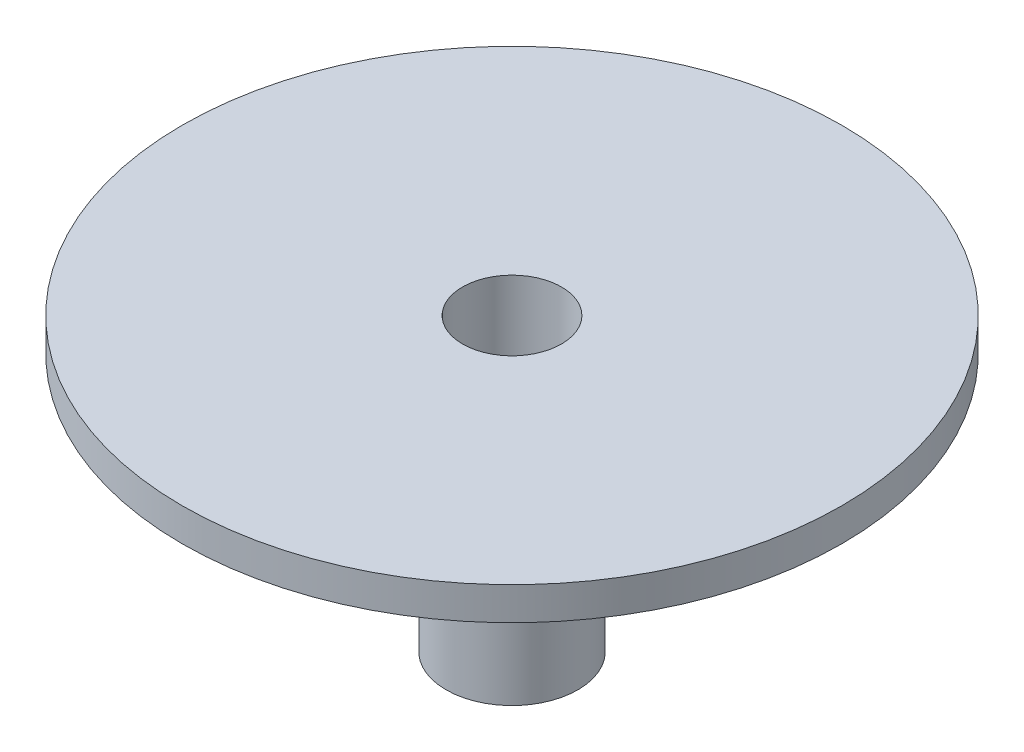
ISO-10303-21;
HEADER;
FILE_DESCRIPTION(('STEP AP214'),'2;1');
FILE_NAME('part.step','',(''),(''),'','','');
FILE_SCHEMA(('AUTOMOTIVE_DESIGN { 1 0 10303 214 1 1 1 1 }'));
ENDSEC;
DATA;
#1=APPLICATION_CONTEXT('core data for automotive mechanical design processes');
#2=APPLICATION_PROTOCOL_DEFINITION('international standard','automotive_design',2000,#1);
#3=PRODUCT_CONTEXT('',#1,'mechanical');
#4=PRODUCT('Part','Part','',(#3));
#5=PRODUCT_RELATED_PRODUCT_CATEGORY('part','',(#4));
#6=PRODUCT_DEFINITION_FORMATION('','',#4);
#7=PRODUCT_DEFINITION_CONTEXT('part definition',#1,'design');
#8=PRODUCT_DEFINITION('design','',#6,#7);
#9=PRODUCT_DEFINITION_SHAPE('','',#8);
#10=(LENGTH_UNIT() NAMED_UNIT(*) SI_UNIT(.MILLI.,.METRE.));
#11=(NAMED_UNIT(*) PLANE_ANGLE_UNIT() SI_UNIT($,.RADIAN.));
#12=(NAMED_UNIT(*) SI_UNIT($,.STERADIAN.) SOLID_ANGLE_UNIT());
#13=UNCERTAINTY_MEASURE_WITH_UNIT(LENGTH_MEASURE(1.E-05),#10,'distance_accuracy_value','');
#14=(GEOMETRIC_REPRESENTATION_CONTEXT(3) GLOBAL_UNCERTAINTY_ASSIGNED_CONTEXT((#13)) GLOBAL_UNIT_ASSIGNED_CONTEXT((#10,
#11,#12)) REPRESENTATION_CONTEXT('',''));
#15=CARTESIAN_POINT('',(0.,0.,0.));
#16=DIRECTION('',(0.,0.,1.));
#17=DIRECTION('',(1.,0.,0.));
#18=AXIS2_PLACEMENT_3D('',#15,#16,#17);
#19=CARTESIAN_POINT('',(0.,10.25,7.5));
#20=DIRECTION('',(0.,-1.,0.));
#21=DIRECTION('',(0.,0.,-1.));
#22=AXIS2_PLACEMENT_3D('',#19,#20,#21);
#23=PLANE('',#22);
#24=CARTESIAN_POINT('',(0.,10.25,0.));
#25=DIRECTION('',(0.,1.,0.));
#26=DIRECTION('',(0.,0.,1.));
#27=AXIS2_PLACEMENT_3D('',#24,#25,#26);
#28=CIRCLE('',#27,7.5);
#29=CARTESIAN_POINT('',(0.,10.25,7.5));
#30=VERTEX_POINT('',#29);
#31=EDGE_CURVE('E72',#30,#30,#28,.T.);
#32=ORIENTED_EDGE('',*,*,#31,.T.);
#33=EDGE_LOOP('',(#32));
#34=FACE_BOUND('',#33,.T.);
#35=CARTESIAN_POINT('',(0.,10.25,0.));
#36=DIRECTION('',(0.,1.,0.));
#37=DIRECTION('',(0.,0.,1.));
#38=AXIS2_PLACEMENT_3D('',#35,#36,#37);
#39=CIRCLE('',#38,30.);
#40=CARTESIAN_POINT('',(0.,10.25,30.));
#41=VERTEX_POINT('',#40);
#42=EDGE_CURVE('E10',#41,#41,#39,.T.);
#43=ORIENTED_EDGE('',*,*,#42,.F.);
#44=EDGE_LOOP('',(#43));
#45=FACE_BOUND('',#44,.T.);
#46=ADVANCED_FACE('F37',(#34,#45),#23,.T.);
#47=CARTESIAN_POINT('',(0.,33.1278052299599,0.));
#48=DIRECTION('',(0.,1.,0.));
#49=DIRECTION('',(0.,0.,1.));
#50=AXIS2_PLACEMENT_3D('',#47,#48,#49);
#51=CYLINDRICAL_SURFACE('',#50,30.);
#52=ORIENTED_EDGE('',*,*,#42,.T.);
#53=EDGE_LOOP('',(#52));
#54=FACE_BOUND('',#53,.T.);
#55=CARTESIAN_POINT('',(0.,13.25,0.));
#56=DIRECTION('',(0.,1.,0.));
#57=DIRECTION('',(0.,0.,1.));
#58=AXIS2_PLACEMENT_3D('',#55,#56,#57);
#59=CIRCLE('',#58,30.);
#60=CARTESIAN_POINT('',(0.,13.25,30.));
#61=VERTEX_POINT('',#60);
#62=EDGE_CURVE('E44',#61,#61,#59,.T.);
#63=ORIENTED_EDGE('',*,*,#62,.F.);
#64=EDGE_LOOP('',(#63));
#65=FACE_BOUND('',#64,.T.);
#66=ADVANCED_FACE('F91',(#54,#65),#51,.T.);
#67=CARTESIAN_POINT('',(0.,13.25,30.));
#68=DIRECTION('',(0.,1.,0.));
#69=DIRECTION('',(0.,0.,1.));
#70=AXIS2_PLACEMENT_3D('',#67,#68,#69);
#71=PLANE('',#70);
#72=ORIENTED_EDGE('',*,*,#62,.T.);
#73=EDGE_LOOP('',(#72));
#74=FACE_BOUND('',#73,.T.);
#75=CARTESIAN_POINT('',(0.,13.25,0.));
#76=DIRECTION('',(0.,1.,0.));
#77=DIRECTION('',(0.,0.,1.));
#78=AXIS2_PLACEMENT_3D('',#75,#76,#77);
#79=CIRCLE('',#78,4.50000000000001);
#80=CARTESIAN_POINT('',(0.,13.25,4.50000000000001));
#81=VERTEX_POINT('',#80);
#82=EDGE_CURVE('E49',#81,#81,#79,.T.);
#83=ORIENTED_EDGE('',*,*,#82,.F.);
#84=EDGE_LOOP('',(#83));
#85=FACE_BOUND('',#84,.T.);
#86=ADVANCED_FACE('F95',(#74,#85),#71,.T.);
#87=CARTESIAN_POINT('',(0.,33.1278052299599,0.));
#88=DIRECTION('',(0.,1.,0.));
#89=DIRECTION('',(0.,0.,1.));
#90=AXIS2_PLACEMENT_3D('',#87,#88,#89);
#91=CYLINDRICAL_SURFACE('',#90,4.50000000000001);
#92=ORIENTED_EDGE('',*,*,#82,.T.);
#93=EDGE_LOOP('',(#92));
#94=FACE_BOUND('',#93,.T.);
#95=CARTESIAN_POINT('',(0.,-13.25,0.));
#96=DIRECTION('',(0.,1.,0.));
#97=DIRECTION('',(0.,0.,1.));
#98=AXIS2_PLACEMENT_3D('',#95,#96,#97);
#99=CIRCLE('',#98,4.50000000000001);
#100=CARTESIAN_POINT('',(0.,-13.25,4.50000000000001));
#101=VERTEX_POINT('',#100);
#102=EDGE_CURVE('E54',#101,#101,#99,.T.);
#103=ORIENTED_EDGE('',*,*,#102,.F.);
#104=EDGE_LOOP('',(#103));
#105=FACE_BOUND('',#104,.T.);
#106=ADVANCED_FACE('F99',(#94,#105),#91,.F.);
#107=CARTESIAN_POINT('',(0.,-13.25,4.50000000000001));
#108=DIRECTION('',(0.,-1.,0.));
#109=DIRECTION('',(0.,0.,-1.));
#110=AXIS2_PLACEMENT_3D('',#107,#108,#109);
#111=PLANE('',#110);
#112=ORIENTED_EDGE('',*,*,#102,.T.);
#113=EDGE_LOOP('',(#112));
#114=FACE_BOUND('',#113,.T.);
#115=CARTESIAN_POINT('',(0.,-13.25,0.));
#116=DIRECTION('',(0.,1.,0.));
#117=DIRECTION('',(0.,0.,1.));
#118=AXIS2_PLACEMENT_3D('',#115,#116,#117);
#119=CIRCLE('',#118,6.00000000000001);
#120=CARTESIAN_POINT('',(0.,-13.25,6.00000000000001));
#121=VERTEX_POINT('',#120);
#122=EDGE_CURVE('E60',#121,#121,#119,.T.);
#123=ORIENTED_EDGE('',*,*,#122,.F.);
#124=EDGE_LOOP('',(#123));
#125=FACE_BOUND('',#124,.T.);
#126=ADVANCED_FACE('F105',(#114,#125),#111,.T.);
#127=CARTESIAN_POINT('',(0.,33.1278052299599,0.));
#128=DIRECTION('',(0.,1.,0.));
#129=DIRECTION('',(0.,0.,1.));
#130=AXIS2_PLACEMENT_3D('',#127,#128,#129);
#131=CYLINDRICAL_SURFACE('',#130,6.00000000000001);
#132=ORIENTED_EDGE('',*,*,#122,.T.);
#133=EDGE_LOOP('',(#132));
#134=FACE_BOUND('',#133,.T.);
#135=CARTESIAN_POINT('',(0.,-2.75,0.));
#136=DIRECTION('',(0.,1.,0.));
#137=DIRECTION('',(0.,0.,1.));
#138=AXIS2_PLACEMENT_3D('',#135,#136,#137);
#139=CIRCLE('',#138,6.00000000000001);
#140=CARTESIAN_POINT('',(0.,-2.75,6.00000000000001));
#141=VERTEX_POINT('',#140);
#142=EDGE_CURVE('E64',#141,#141,#139,.T.);
#143=ORIENTED_EDGE('',*,*,#142,.F.);
#144=EDGE_LOOP('',(#143));
#145=FACE_BOUND('',#144,.T.);
#146=ADVANCED_FACE('F87',(#134,#145),#131,.T.);
#147=CARTESIAN_POINT('',(0.,-2.75,7.50000000000001));
#148=DIRECTION('',(0.,-1.,0.));
#149=DIRECTION('',(0.,0.,-1.));
#150=AXIS2_PLACEMENT_3D('',#147,#148,#149);
#151=PLANE('',#150);
#152=ORIENTED_EDGE('',*,*,#142,.T.);
#153=EDGE_LOOP('',(#152));
#154=FACE_BOUND('',#153,.T.);
#155=CARTESIAN_POINT('',(0.,-2.75,0.));
#156=DIRECTION('',(0.,1.,0.));
#157=DIRECTION('',(0.,0.,1.));
#158=AXIS2_PLACEMENT_3D('',#155,#156,#157);
#159=CIRCLE('',#158,7.50000000000001);
#160=CARTESIAN_POINT('',(0.,-2.75,7.50000000000001));
#161=VERTEX_POINT('',#160);
#162=EDGE_CURVE('E68',#161,#161,#159,.T.);
#163=ORIENTED_EDGE('',*,*,#162,.F.);
#164=EDGE_LOOP('',(#163));
#165=FACE_BOUND('',#164,.T.);
#166=ADVANCED_FACE('F81',(#154,#165),#151,.T.);
#167=CARTESIAN_POINT('',(0.,33.1278052299599,0.));
#168=DIRECTION('',(0.,1.,0.));
#169=DIRECTION('',(0.,0.,1.));
#170=AXIS2_PLACEMENT_3D('',#167,#168,#169);
#171=CYLINDRICAL_SURFACE('',#170,7.5);
#172=ORIENTED_EDGE('',*,*,#162,.T.);
#173=EDGE_LOOP('',(#172));
#174=FACE_BOUND('',#173,.T.);
#175=ORIENTED_EDGE('',*,*,#31,.F.);
#176=EDGE_LOOP('',(#175));
#177=FACE_BOUND('',#176,.T.);
#178=ADVANCED_FACE('F79',(#174,#177),#171,.T.);
#179=CLOSED_SHELL('',(#46,#66,#86,#106,#126,#146,#166,#178));
#180=MANIFOLD_SOLID_BREP('B2',#179);
#181=ADVANCED_BREP_SHAPE_REPRESENTATION('',(#18,#180),#14);
#182=SHAPE_DEFINITION_REPRESENTATION(#9,#181);
ENDSEC;
END-ISO-10303-21;
